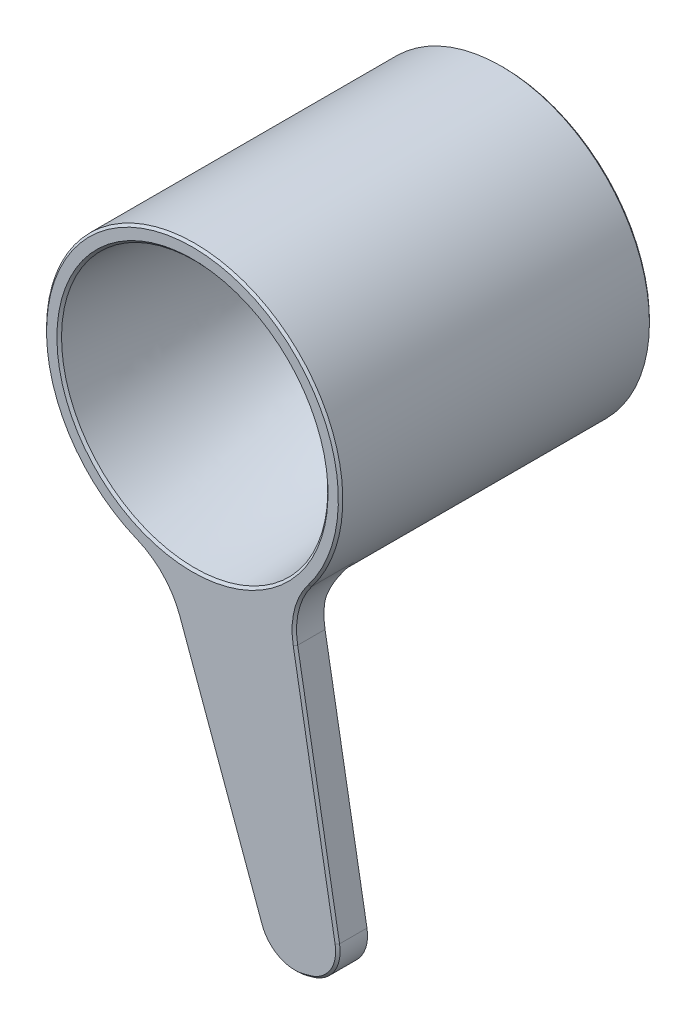
ISO-10303-21;
HEADER;
FILE_DESCRIPTION(('STEP AP214'),'2;1');
FILE_NAME('part.step','',(''),(''),'','','');
FILE_SCHEMA(('AUTOMOTIVE_DESIGN { 1 0 10303 214 1 1 1 1 }'));
ENDSEC;
DATA;
#1=APPLICATION_CONTEXT('core data for automotive mechanical design processes');
#2=APPLICATION_PROTOCOL_DEFINITION('international standard','automotive_design',2000,#1);
#3=PRODUCT_CONTEXT('',#1,'mechanical');
#4=PRODUCT('Part','Part','',(#3));
#5=PRODUCT_RELATED_PRODUCT_CATEGORY('part','',(#4));
#6=PRODUCT_DEFINITION_FORMATION('','',#4);
#7=PRODUCT_DEFINITION_CONTEXT('part definition',#1,'design');
#8=PRODUCT_DEFINITION('design','',#6,#7);
#9=PRODUCT_DEFINITION_SHAPE('','',#8);
#10=(LENGTH_UNIT() NAMED_UNIT(*) SI_UNIT(.MILLI.,.METRE.));
#11=(NAMED_UNIT(*) PLANE_ANGLE_UNIT() SI_UNIT($,.RADIAN.));
#12=(NAMED_UNIT(*) SI_UNIT($,.STERADIAN.) SOLID_ANGLE_UNIT());
#13=UNCERTAINTY_MEASURE_WITH_UNIT(LENGTH_MEASURE(1.E-05),#10,'distance_accuracy_value','');
#14=(GEOMETRIC_REPRESENTATION_CONTEXT(3) GLOBAL_UNCERTAINTY_ASSIGNED_CONTEXT((#13)) GLOBAL_UNIT_ASSIGNED_CONTEXT((#10,
#11,#12)) REPRESENTATION_CONTEXT('',''));
#15=CARTESIAN_POINT('',(0.,0.,0.));
#16=DIRECTION('',(0.,0.,1.));
#17=DIRECTION('',(1.,0.,0.));
#18=AXIS2_PLACEMENT_3D('',#15,#16,#17);
#19=CARTESIAN_POINT('',(-101.876054848858,-143.2985377115,29.3));
#20=DIRECTION('',(0.,0.,-1.));
#21=DIRECTION('',(-0.258819045102522,0.965925826289068,0.));
#22=AXIS2_PLACEMENT_3D('',#19,#20,#21);
#23=CONICAL_SURFACE('',#22,18.0000000000096,0.785398162500003);
#24=CARTESIAN_POINT('',(-101.876054848858,-143.2985377115,29.3));
#25=DIRECTION('',(0.,0.,-1.));
#26=DIRECTION('',(-0.258819045102523,0.965925826289068,0.));
#27=AXIS2_PLACEMENT_3D('',#24,#25,#26);
#28=CIRCLE('',#27,18.0000000000096);
#29=CARTESIAN_POINT('',(-106.534797660706,-125.911872838288,29.3));
#30=VERTEX_POINT('',#29);
#31=EDGE_CURVE('E220',#30,#30,#28,.T.);
#32=ORIENTED_EDGE('',*,*,#31,.F.);
#33=EDGE_LOOP('',(#32));
#34=FACE_BOUND('',#33,.T.);
#35=CARTESIAN_POINT('',(-101.876054848858,-143.2985377115,29.));
#36=DIRECTION('',(0.,0.,1.));
#37=DIRECTION('',(-0.258819045102522,0.965925826289068,0.));
#38=AXIS2_PLACEMENT_3D('',#35,#36,#37);
#39=CIRCLE('',#38,18.3000000000096);
#40=CARTESIAN_POINT('',(-106.612443374237,-125.622095090401,29.));
#41=VERTEX_POINT('',#40);
#42=EDGE_CURVE('E243',#41,#41,#39,.T.);
#43=ORIENTED_EDGE('',*,*,#42,.F.);
#44=EDGE_LOOP('',(#43));
#45=FACE_BOUND('',#44,.T.);
#46=ADVANCED_FACE('F42',(#34,#45),#23,.F.);
#47=CARTESIAN_POINT('',(-101.876054848858,-143.2985377115,29.));
#48=DIRECTION('',(0.,0.,1.));
#49=DIRECTION('',(0.258819045102522,-0.965925826289068,0.));
#50=AXIS2_PLACEMENT_3D('',#47,#48,#49);
#51=CONICAL_SURFACE('',#50,19.7,0.785398162500003);
#52=CARTESIAN_POINT('',(-101.876054848858,-143.2985377115,29.));
#53=DIRECTION('',(0.,0.,-1.));
#54=DIRECTION('',(-0.258819045102522,0.965925826289068,0.));
#55=AXIS2_PLACEMENT_3D('',#52,#53,#54);
#56=CIRCLE('',#55,19.7);
#57=CARTESIAN_POINT('',(-106.974790037378,-124.269798933606,29.));
#58=VERTEX_POINT('',#57);
#59=EDGE_CURVE('E241',#58,#58,#56,.T.);
#60=ORIENTED_EDGE('',*,*,#59,.F.);
#61=EDGE_LOOP('',(#60));
#62=FACE_BOUND('',#61,.T.);
#63=CARTESIAN_POINT('',(-101.876054848858,-143.2985377115,29.3));
#64=DIRECTION('',(0.,0.,1.));
#65=DIRECTION('',(-0.258819045102522,0.965925826289068,0.));
#66=AXIS2_PLACEMENT_3D('',#63,#64,#65);
#67=CIRCLE('',#66,20.);
#68=CARTESIAN_POINT('',(-107.052435750909,-123.980021185719,29.3));
#69=VERTEX_POINT('',#68);
#70=EDGE_CURVE('E207',#69,#69,#67,.T.);
#71=ORIENTED_EDGE('',*,*,#70,.F.);
#72=EDGE_LOOP('',(#71));
#73=FACE_BOUND('',#72,.T.);
#74=ADVANCED_FACE('F44',(#62,#73),#51,.T.);
#75=CARTESIAN_POINT('',(-105.588769718902,-162.950910298385,70.7));
#76=DIRECTION('',(0.664463024388675,0.24184476264798,-0.707106781186546));
#77=DIRECTION('',(0.,-0.946188648339463,-0.323615577118191));
#78=AXIS2_PLACEMENT_3D('',#75,#76,#77);
#79=PLANE('',#78);
#80=DIRECTION('',(0.664463024388668,0.241844762647976,0.707106781186553));
#81=VECTOR('',#80,1.);
#82=CARTESIAN_POINT('',(-92.7435598715085,-198.242834302256,70.7));
#83=LINE('',#82,#81);
#84=CARTESIAN_POINT('',(-92.7435598715085,-198.242834302256,70.7));
#85=VERTEX_POINT('',#84);
#86=CARTESIAN_POINT('',(-92.4616520852727,-198.140228259258,71.));
#87=VERTEX_POINT('',#86);
#88=EDGE_CURVE('E52',#85,#87,#83,.T.);
#89=ORIENTED_EDGE('',*,*,#88,.T.);
#90=DIRECTION('',(0.342020143325675,-0.939692620785906,0.));
#91=VECTOR('',#90,1.);
#92=CARTESIAN_POINT('',(-104.37433452665,-165.41040224644,71.));
#93=LINE('',#92,#91);
#94=CARTESIAN_POINT('',(-103.605857648852,-167.521775115563,71.));
#95=VERTEX_POINT('',#94);
#96=EDGE_CURVE('E217',#95,#87,#93,.T.);
#97=ORIENTED_EDGE('',*,*,#96,.F.);
#98=DIRECTION('',(-0.664463024388672,-0.241844762647977,-0.707106781186549));
#99=VECTOR('',#98,1.);
#100=CARTESIAN_POINT('',(-103.605857648852,-167.521775115563,71.));
#101=LINE('',#100,#99);
#102=CARTESIAN_POINT('',(-103.887765435088,-167.62438115856,70.7));
#103=VERTEX_POINT('',#102);
#104=EDGE_CURVE('E11',#95,#103,#101,.T.);
#105=ORIENTED_EDGE('',*,*,#104,.T.);
#106=DIRECTION('',(-0.342020143325675,0.939692620785906,0.));
#107=VECTOR('',#106,1.);
#108=CARTESIAN_POINT('',(-105.588769718902,-162.950910298385,70.7));
#109=LINE('',#108,#107);
#110=EDGE_CURVE('E266',#85,#103,#109,.T.);
#111=ORIENTED_EDGE('',*,*,#110,.F.);
#112=EDGE_LOOP('',(#89,#97,#105,#111));
#113=FACE_BOUND('',#112,.T.);
#114=ADVANCED_FACE('F416',(#113),#79,.F.);
#115=CARTESIAN_POINT('',(-113.284691642947,-171.044582591817,71.));
#116=DIRECTION('',(0.,0.,1.));
#117=DIRECTION('',(0.258819045102522,-0.965925826289068,0.));
#118=AXIS2_PLACEMENT_3D('',#115,#116,#117);
#119=CONICAL_SURFACE('',#118,10.3,0.785398162499996);
#120=DIRECTION('',(-0.268904148039819,-0.653980549532613,-0.707106781186549));
#121=VECTOR('',#120,1.);
#122=CARTESIAN_POINT('',(-109.367726343643,-161.518440516242,71.));
#123=LINE('',#122,#121);
#124=CARTESIAN_POINT('',(-109.367726343643,-161.518440516242,71.));
#125=VERTEX_POINT('',#124);
#126=CARTESIAN_POINT('',(-109.481812711584,-161.795900965045,70.7));
#127=VERTEX_POINT('',#126);
#128=EDGE_CURVE('E288',#125,#127,#123,.T.);
#129=ORIENTED_EDGE('',*,*,#128,.T.);
#130=CARTESIAN_POINT('',(-113.284691642947,-171.044582591817,70.7));
#131=DIRECTION('',(0.,0.,1.));
#132=DIRECTION('',(0.258819045102522,-0.965925826289068,0.));
#133=AXIS2_PLACEMENT_3D('',#130,#131,#132);
#134=CIRCLE('',#133,10.);
#135=EDGE_CURVE('E366',#103,#127,#134,.T.);
#136=ORIENTED_EDGE('',*,*,#135,.F.);
#137=ORIENTED_EDGE('',*,*,#104,.F.);
#138=CARTESIAN_POINT('',(-113.284691642947,-171.044582591817,71.));
#139=DIRECTION('',(0.,0.,-1.));
#140=DIRECTION('',(0.258819045102521,-0.965925826289068,0.));
#141=AXIS2_PLACEMENT_3D('',#138,#139,#140);
#142=CIRCLE('',#141,10.3);
#143=EDGE_CURVE('E228',#125,#95,#142,.T.);
#144=ORIENTED_EDGE('',*,*,#143,.F.);
#145=EDGE_LOOP('',(#129,#136,#137,#144));
#146=FACE_BOUND('',#145,.T.);
#147=ADVANCED_FACE('F397',(#146),#119,.F.);
#148=CARTESIAN_POINT('',(-88.0450967675789,-196.532733585627,71.));
#149=DIRECTION('',(0.,0.,-1.));
#150=DIRECTION('',(-0.258819045102522,0.965925826289068,0.));
#151=AXIS2_PLACEMENT_3D('',#148,#149,#150);
#152=CONICAL_SURFACE('',#151,4.7,0.785398162499998);
#153=DIRECTION('',(-0.183012701892219,0.683012701892228,0.707106781186539));
#154=VECTOR('',#153,1.);
#155=CARTESIAN_POINT('',(-86.7510015420663,-201.362362717073,70.7));
#156=LINE('',#155,#154);
#157=CARTESIAN_POINT('',(-86.7510015420663,-201.362362717073,70.7));
#158=VERTEX_POINT('',#157);
#159=CARTESIAN_POINT('',(-86.8286472555971,-201.072584969186,71.));
#160=VERTEX_POINT('',#159);
#161=EDGE_CURVE('E291',#158,#160,#156,.T.);
#162=ORIENTED_EDGE('',*,*,#161,.T.);
#163=CARTESIAN_POINT('',(-88.0450967675789,-196.532733585627,71.));
#164=DIRECTION('',(0.,0.,1.));
#165=DIRECTION('',(0.258819045102523,-0.965925826289068,0.));
#166=AXIS2_PLACEMENT_3D('',#163,#164,#165);
#167=CIRCLE('',#166,4.7);
#168=EDGE_CURVE('E213',#87,#160,#167,.T.);
#169=ORIENTED_EDGE('',*,*,#168,.F.);
#170=ORIENTED_EDGE('',*,*,#88,.F.);
#171=CARTESIAN_POINT('',(-88.0450967675789,-196.532733585627,70.7));
#172=DIRECTION('',(0.,0.,-1.));
#173=DIRECTION('',(0.258819045102522,-0.965925826289068,0.));
#174=AXIS2_PLACEMENT_3D('',#171,#172,#173);
#175=CIRCLE('',#174,5.);
#176=EDGE_CURVE('E246',#158,#85,#175,.T.);
#177=ORIENTED_EDGE('',*,*,#176,.F.);
#178=EDGE_LOOP('',(#162,#169,#170,#177));
#179=FACE_BOUND('',#178,.T.);
#180=ADVANCED_FACE('F442',(#179),#152,.T.);
#181=CARTESIAN_POINT('',(-101.876054848858,-143.2985377115,70.7));
#182=DIRECTION('',(0.,0.,-1.));
#183=DIRECTION('',(-0.258819045102522,0.965925826289068,0.));
#184=AXIS2_PLACEMENT_3D('',#181,#182,#183);
#185=CONICAL_SURFACE('',#184,20.,0.7853981625);
#186=DIRECTION('',(0.559868098151802,-0.431911695456239,-0.707106781186549));
#187=VECTOR('',#186,1.);
#188=CARTESIAN_POINT('',(-86.278125615196,-155.331600647497,71.));
#189=LINE('',#188,#187);
#190=CARTESIAN_POINT('',(-86.278125615196,-155.331600647497,71.));
#191=VERTEX_POINT('',#190);
#192=CARTESIAN_POINT('',(-86.0405936979321,-155.514845260736,70.7));
#193=VERTEX_POINT('',#192);
#194=EDGE_CURVE('E238',#191,#193,#189,.T.);
#195=ORIENTED_EDGE('',*,*,#194,.T.);
#196=CARTESIAN_POINT('',(-101.876054848858,-143.2985377115,70.7));
#197=DIRECTION('',(0.,0.,-1.));
#198=DIRECTION('',(0.258819045102522,-0.965925826289068,0.));
#199=AXIS2_PLACEMENT_3D('',#196,#197,#198);
#200=CIRCLE('',#199,20.);
#201=EDGE_CURVE('E197',#127,#193,#200,.T.);
#202=ORIENTED_EDGE('',*,*,#201,.F.);
#203=ORIENTED_EDGE('',*,*,#128,.F.);
#204=CARTESIAN_POINT('',(-101.876054848858,-143.2985377115,71.));
#205=DIRECTION('',(0.,0.,1.));
#206=DIRECTION('',(0.258819045102523,-0.965925826289068,0.));
#207=AXIS2_PLACEMENT_3D('',#204,#205,#206);
#208=CIRCLE('',#207,19.7);
#209=EDGE_CURVE('E259',#191,#125,#208,.T.);
#210=ORIENTED_EDGE('',*,*,#209,.F.);
#211=EDGE_LOOP('',(#195,#202,#203,#210));
#212=FACE_BOUND('',#211,.T.);
#213=ADVANCED_FACE('F395',(#212),#185,.T.);
#214=CARTESIAN_POINT('',(-91.1765412741523,-202.548182514357,70.7));
#215=DIRECTION('',(-0.183012701892217,0.68301270189222,-0.707106781186548));
#216=DIRECTION('',(-0.968100345886376,0.,0.250562807085728));
#217=AXIS2_PLACEMENT_3D('',#214,#215,#216);
#218=PLANE('',#217);
#219=DIRECTION('',(-0.183012701892217,0.68301270189222,0.707106781186548));
#220=VECTOR('',#219,1.);
#221=CARTESIAN_POINT('',(-85.9428227433477,-201.145811860616,70.7));
#222=LINE('',#221,#220);
#223=CARTESIAN_POINT('',(-85.9428227433477,-201.145811860616,70.7));
#224=VERTEX_POINT('',#223);
#225=CARTESIAN_POINT('',(-86.0204684568785,-200.856034112729,71.));
#226=VERTEX_POINT('',#225);
#227=EDGE_CURVE('E236',#224,#226,#222,.T.);
#228=ORIENTED_EDGE('',*,*,#227,.T.);
#229=DIRECTION('',(0.965925826289069,0.258819045102518,0.));
#230=VECTOR('',#229,1.);
#231=CARTESIAN_POINT('',(-86.4245578562379,-200.964309540958,71.));
#232=LINE('',#231,#230);
#233=EDGE_CURVE('E216',#160,#226,#232,.T.);
#234=ORIENTED_EDGE('',*,*,#233,.F.);
#235=ORIENTED_EDGE('',*,*,#161,.F.);
#236=DIRECTION('',(-0.965925826289069,-0.258819045102518,0.));
#237=VECTOR('',#236,1.);
#238=CARTESIAN_POINT('',(-91.1765412741523,-202.548182514357,70.7));
#239=LINE('',#238,#237);
#240=EDGE_CURVE('E232',#224,#158,#239,.T.);
#241=ORIENTED_EDGE('',*,*,#240,.F.);
#242=EDGE_LOOP('',(#228,#234,#235,#241));
#243=FACE_BOUND('',#242,.T.);
#244=ADVANCED_FACE('F383',(#243),#218,.F.);
#245=CARTESIAN_POINT('',(-78.122863122469,-161.622999035353,71.));
#246=DIRECTION('',(0.,0.,1.));
#247=DIRECTION('',(0.258819045102522,-0.965925826289068,0.));
#248=AXIS2_PLACEMENT_3D('',#245,#246,#247);
#249=CONICAL_SURFACE('',#248,10.3,0.785398162499996);
#250=DIRECTION('',(0.696364240320018,0.122787803968972,-0.707106781186549));
#251=VECTOR('',#250,1.);
#252=CARTESIAN_POINT('',(-88.2663829784947,-163.411575265323,71.));
#253=LINE('',#252,#251);
#254=CARTESIAN_POINT('',(-88.2663829784947,-163.411575265323,71.));
#255=VERTEX_POINT('',#254);
#256=CARTESIAN_POINT('',(-87.9709406525911,-163.359480812023,70.7));
#257=VERTEX_POINT('',#256);
#258=EDGE_CURVE('E284',#255,#257,#253,.T.);
#259=ORIENTED_EDGE('',*,*,#258,.T.);
#260=CARTESIAN_POINT('',(-78.122863122469,-161.622999035353,70.7));
#261=DIRECTION('',(0.,0.,1.));
#262=DIRECTION('',(0.258819045102522,-0.965925826289068,0.));
#263=AXIS2_PLACEMENT_3D('',#260,#261,#262);
#264=CIRCLE('',#263,10.);
#265=EDGE_CURVE('E165',#193,#257,#264,.T.);
#266=ORIENTED_EDGE('',*,*,#265,.F.);
#267=ORIENTED_EDGE('',*,*,#194,.F.);
#268=CARTESIAN_POINT('',(-78.122863122469,-161.622999035353,71.));
#269=DIRECTION('',(0.,0.,-1.));
#270=DIRECTION('',(0.258819045102521,-0.965925826289068,0.));
#271=AXIS2_PLACEMENT_3D('',#268,#269,#270);
#272=CIRCLE('',#271,10.3);
#273=EDGE_CURVE('E256',#255,#191,#272,.T.);
#274=ORIENTED_EDGE('',*,*,#273,.F.);
#275=EDGE_LOOP('',(#259,#266,#267,#274));
#276=FACE_BOUND('',#275,.T.);
#277=ADVANCED_FACE('F393',(#276),#249,.F.);
#278=CARTESIAN_POINT('',(-87.2369179688603,-196.316182729171,71.));
#279=DIRECTION('',(0.,0.,-1.));
#280=DIRECTION('',(-0.258819045102522,0.965925826289068,0.));
#281=AXIS2_PLACEMENT_3D('',#278,#279,#280);
#282=CONICAL_SURFACE('',#281,4.7,0.785398162500005);
#283=DIRECTION('',(-0.696364240320017,-0.122787803968971,0.70710678118655));
#284=VECTOR('',#283,1.);
#285=CARTESIAN_POINT('',(-82.3128792037993,-195.447941840836,70.7));
#286=LINE('',#285,#284);
#287=CARTESIAN_POINT('',(-82.3128792037993,-195.447941840836,70.7));
#288=VERTEX_POINT('',#287);
#289=CARTESIAN_POINT('',(-82.6083215297029,-195.500036294136,71.));
#290=VERTEX_POINT('',#289);
#291=EDGE_CURVE('E60',#288,#290,#286,.T.);
#292=ORIENTED_EDGE('',*,*,#291,.T.);
#293=CARTESIAN_POINT('',(-87.2369179688603,-196.316182729171,71.));
#294=DIRECTION('',(0.,0.,1.));
#295=DIRECTION('',(0.258819045102523,-0.965925826289068,0.));
#296=AXIS2_PLACEMENT_3D('',#293,#294,#295);
#297=CIRCLE('',#296,4.7);
#298=EDGE_CURVE('E250',#226,#290,#297,.T.);
#299=ORIENTED_EDGE('',*,*,#298,.F.);
#300=ORIENTED_EDGE('',*,*,#227,.F.);
#301=CARTESIAN_POINT('',(-87.2369179688603,-196.316182729171,70.7));
#302=DIRECTION('',(0.,0.,-1.));
#303=DIRECTION('',(0.258819045102522,-0.965925826289068,0.));
#304=AXIS2_PLACEMENT_3D('',#301,#302,#303);
#305=CIRCLE('',#304,5.);
#306=EDGE_CURVE('E279',#288,#224,#305,.T.);
#307=ORIENTED_EDGE('',*,*,#306,.F.);
#308=EDGE_LOOP('',(#292,#299,#300,#307));
#309=FACE_BOUND('',#308,.T.);
#310=ADVANCED_FACE('F387',(#309),#282,.T.);
#311=CARTESIAN_POINT('',(-81.5172830112617,-199.959992063332,70.7));
#312=DIRECTION('',(-0.696364240320022,-0.12278780396897,-0.707106781186545));
#313=DIRECTION('',(-0.712498293208667,0.,0.701673843159866));
#314=AXIS2_PLACEMENT_3D('',#311,#312,#313);
#315=PLANE('',#314);
#316=ORIENTED_EDGE('',*,*,#258,.F.);
#317=DIRECTION('',(-0.173648177666926,0.984807753012209,0.));
#318=VECTOR('',#317,1.);
#319=CARTESIAN_POINT('',(-88.656548914662,-161.198834284903,71.));
#320=LINE('',#319,#318);
#321=EDGE_CURVE('E253',#290,#255,#320,.T.);
#322=ORIENTED_EDGE('',*,*,#321,.F.);
#323=ORIENTED_EDGE('',*,*,#291,.F.);
#324=DIRECTION('',(0.173648177666926,-0.984807753012209,0.));
#325=VECTOR('',#324,1.);
#326=CARTESIAN_POINT('',(-81.5172830112617,-199.959992063332,70.7));
#327=LINE('',#326,#325);
#328=EDGE_CURVE('E168',#257,#288,#327,.T.);
#329=ORIENTED_EDGE('',*,*,#328,.F.);
#330=EDGE_LOOP('',(#316,#322,#323,#329));
#331=FACE_BOUND('',#330,.T.);
#332=ADVANCED_FACE('F388',(#331),#315,.F.);
#333=CARTESIAN_POINT('',(-101.876054848858,-143.2985377115,71.));
#334=DIRECTION('',(0.,0.,1.));
#335=DIRECTION('',(0.258819045102522,-0.965925826289068,0.));
#336=AXIS2_PLACEMENT_3D('',#333,#334,#335);
#337=CONICAL_SURFACE('',#336,18.3001939572869,0.829672497558748);
#338=CARTESIAN_POINT('',(-101.876054848858,-143.2985377115,71.));
#339=DIRECTION('',(0.,0.,-1.));
#340=DIRECTION('',(0.258819045102522,-0.965925826289068,0.));
#341=AXIS2_PLACEMENT_3D('',#338,#339,#340);
#342=CIRCLE('',#341,18.3001939572869);
#343=CARTESIAN_POINT('',(-97.1396161236424,-160.975167680943,71.));
#344=VERTEX_POINT('',#343);
#345=EDGE_CURVE('E248',#344,#344,#342,.T.);
#346=ORIENTED_EDGE('',*,*,#345,.F.);
#347=EDGE_LOOP('',(#346));
#348=FACE_BOUND('',#347,.T.);
#349=CARTESIAN_POINT('',(-101.876054848858,-143.2985377115,70.7011753617605));
#350=DIRECTION('',(0.,0.,1.));
#351=DIRECTION('',(-0.258819045102523,0.965925826289068,0.));
#352=AXIS2_PLACEMENT_3D('',#349,#350,#351);
#353=CIRCLE('',#352,17.9736640575314);
#354=CARTESIAN_POINT('',(-106.527981417222,-125.937311405287,70.7011753617605));
#355=VERTEX_POINT('',#354);
#356=EDGE_CURVE('E201',#355,#355,#353,.T.);
#357=ORIENTED_EDGE('',*,*,#356,.F.);
#358=EDGE_LOOP('',(#357));
#359=FACE_BOUND('',#358,.T.);
#360=ADVANCED_FACE('F336',(#348,#359),#337,.F.);
#361=CARTESIAN_POINT('',(-101.876054848858,-143.2985377115,47.5807574279534));
#362=DIRECTION('',(0.,0.,-1.));
#363=DIRECTION('',(-0.258819045102522,0.965925826289068,0.));
#364=AXIS2_PLACEMENT_3D('',#361,#362,#363);
#365=TOROIDAL_SURFACE('',#364,17.0000000000096,1.);
#366=CARTESIAN_POINT('',(-101.876054848858,-143.2985377115,47.8605950450817));
#367=DIRECTION('',(0.,0.,-1.));
#368=DIRECTION('',(-0.258819045102523,0.965925826289068,0.));
#369=AXIS2_PLACEMENT_3D('',#366,#367,#368);
#370=CIRCLE('',#369,16.0399526532396);
#371=CARTESIAN_POINT('',(-106.027500078059,-127.805133191282,47.8605950450817));
#372=VERTEX_POINT('',#371);
#373=EDGE_CURVE('E218',#372,#372,#370,.T.);
#374=ORIENTED_EDGE('',*,*,#373,.F.);
#375=EDGE_LOOP('',(#374));
#376=FACE_BOUND('',#375,.T.);
#377=CARTESIAN_POINT('',(-101.876054848858,-143.2985377115,47.5807574279534));
#378=DIRECTION('',(0.,0.,1.));
#379=DIRECTION('',(-0.258819045102523,0.965925826289068,0.));
#380=AXIS2_PLACEMENT_3D('',#377,#378,#379);
#381=CIRCLE('',#380,18.0000000000096);
#382=CARTESIAN_POINT('',(-106.534797660706,-125.911872838288,47.5807574279534));
#383=VERTEX_POINT('',#382);
#384=EDGE_CURVE('E235',#383,#383,#381,.T.);
#385=ORIENTED_EDGE('',*,*,#384,.F.);
#386=EDGE_LOOP('',(#385));
#387=FACE_BOUND('',#386,.T.);
#388=ADVANCED_FACE('F333',(#376,#387),#365,.F.);
#389=CARTESIAN_POINT('',(-101.876054848858,-143.2985377115,65.));
#390=DIRECTION('',(0.,0.,-1.));
#391=DIRECTION('',(-0.258819045102522,0.965925826289068,0.));
#392=AXIS2_PLACEMENT_3D('',#389,#390,#391);
#393=TOROIDAL_SURFACE('',#392,22.,2.);
#394=CARTESIAN_POINT('',(-88.0490658405104,-160.410357455847,67.));
#395=CARTESIAN_POINT('',(-88.0430494585621,-160.361104765157,66.9999988846733));
#396=CARTESIAN_POINT('',(-88.036665894473,-160.311901597283,66.9990786135573));
#397=CARTESIAN_POINT('',(-88.023016123055,-160.212487046188,66.9954774444101));
#398=CARTESIAN_POINT('',(-88.0157325286847,-160.162279528959,66.992755176487));
#399=CARTESIAN_POINT('',(-88.0002346007577,-160.060876013287,66.9855515393887));
#400=CARTESIAN_POINT('',(-87.992001886565,-160.009685805144,66.9810288491938));
#401=CARTESIAN_POINT('',(-87.9745573199932,-159.906334945843,66.9702238748284));
#402=CARTESIAN_POINT('',(-87.9653261945512,-159.854181860461,66.9639005892727));
#403=CARTESIAN_POINT('',(-87.9458355444581,-159.748926063997,66.9494940997602));
#404=CARTESIAN_POINT('',(-87.935555935685,-159.695832633091,66.9413704830464));
#405=CARTESIAN_POINT('',(-87.9139184815133,-159.58871879572,66.9233626583347));
#406=CARTESIAN_POINT('',(-87.9025398224681,-159.534709284796,66.9134388305237));
#407=CARTESIAN_POINT('',(-87.878653668062,-159.42578747473,66.8918296847876));
#408=CARTESIAN_POINT('',(-87.8661246987179,-159.370887572368,66.8801057008653));
#409=CARTESIAN_POINT('',(-87.8398874568765,-159.260213491206,66.8548954675482));
#410=CARTESIAN_POINT('',(-87.8261571346471,-159.204453165923,66.8413716348785));
#411=CARTESIAN_POINT('',(-87.7825650901226,-159.033731935474,66.7975994751291));
#412=CARTESIAN_POINT('',(-87.751263701238,-158.919724691229,66.7650326151273));
#413=CARTESIAN_POINT('',(-87.6834135049861,-158.688525772756,66.6929901968356));
#414=CARTESIAN_POINT('',(-87.6466769886534,-158.57147454616,66.6532443609766));
#415=CARTESIAN_POINT('',(-87.5675477961112,-158.334483892696,66.5667741901285));
#416=CARTESIAN_POINT('',(-87.5249621937108,-158.214701682899,66.5197973095904));
#417=CARTESIAN_POINT('',(-87.4336861960737,-157.972501662317,66.4190297558906));
#418=CARTESIAN_POINT('',(-87.3847969951107,-157.850251679366,66.3650158008098));
#419=CARTESIAN_POINT('',(-87.3043350094836,-157.659872574724,66.2757155501991));
#420=CARTESIAN_POINT('',(-87.2740485614894,-157.590445193818,66.2420189720151));
#421=CARTESIAN_POINT('',(-87.2082159997677,-157.444050909616,66.1687890186404));
#422=CARTESIAN_POINT('',(-87.1724938023961,-157.367260297313,66.1290616701248));
#423=CARTESIAN_POINT('',(-87.0951987825248,-157.206435824421,66.043833453269));
#424=CARTESIAN_POINT('',(-87.0534233815516,-157.122574862268,65.9981909108632));
#425=CARTESIAN_POINT('',(-86.9634054473566,-156.948021041324,65.9010661289845));
#426=CARTESIAN_POINT('',(-86.9149390942563,-156.85750975911,65.8494651180206));
#427=CARTESIAN_POINT('',(-86.8108723557514,-156.67011848965,65.7404113515545));
#428=CARTESIAN_POINT('',(-86.7550279936564,-156.573430725572,65.6828612829746));
#429=CARTESIAN_POINT('',(-86.6355056608884,-156.374234027777,65.5618876790935));
#430=CARTESIAN_POINT('',(-86.5715658290848,-156.271932164769,65.4983819163285));
#431=CARTESIAN_POINT('',(-86.4351252813438,-156.062139102565,65.3654875737111));
#432=CARTESIAN_POINT('',(-86.3623467992931,-155.954872779597,65.2960292196373));
#433=CARTESIAN_POINT('',(-86.2074884018219,-155.735886002794,65.1512053132425));
#434=CARTESIAN_POINT('',(-86.125117288316,-155.624411765662,65.0757785830843));
#435=CARTESIAN_POINT('',(-86.0405936979325,-155.514845260736,65.));
#436=B_SPLINE_CURVE_WITH_KNOTS('',3,(#394,#395,#396,#397,#398,#399,#400,#401,#402,#403,#404,
#405,#406,#407,#408,#409,#410,#411,#412,#413,#414,#415,#416,#417,#418,#419,#420,#421,#422,#423,
#424,#425,#426,#427,#428,#429,#430,#431,#432,#433,#434,#435),.UNSPECIFIED.,.F.,.F.,(4,2,2,2,2,2,
2,2,2,2,2,2,2,2,2,2,2,2,2,2,4),(0.,0.148839827569559,0.301221024351109,0.457322166261245,
0.617309372857366,0.781336956881109,0.949548111456634,1.12207561291668,1.29904252198195,
1.66670346563217,2.05338759200283,2.45979538747237,2.88653019897304,3.13520771780149,
3.4158093141493,3.72841746924553,4.07309153570424,4.44987556026427,4.85880306026832,
5.29990007143931,5.77318716565208),.UNSPECIFIED.);
#437=CARTESIAN_POINT('',(-88.0490658405104,-160.410357455847,67.));
#438=VERTEX_POINT('',#437);
#439=CARTESIAN_POINT('',(-86.0405936979321,-155.514845260736,65.));
#440=VERTEX_POINT('',#439);
#441=EDGE_CURVE('E245',#438,#440,#436,.T.);
#442=ORIENTED_EDGE('',*,*,#441,.F.);
#443=CARTESIAN_POINT('',(-101.876054848858,-143.2985377115,67.));
#444=DIRECTION('',(0.,0.,1.));
#445=DIRECTION('',(-0.258819045102522,0.965925826289068,0.));
#446=AXIS2_PLACEMENT_3D('',#443,#444,#445);
#447=CIRCLE('',#446,22.);
#448=CARTESIAN_POINT('',(-105.294668715762,-165.031302819259,67.));
#449=VERTEX_POINT('',#448);
#450=EDGE_CURVE('E183',#449,#438,#447,.T.);
#451=ORIENTED_EDGE('',*,*,#450,.F.);
#452=CARTESIAN_POINT('',(-109.481812711584,-161.795900965045,65.));
#453=CARTESIAN_POINT('',(-109.353851276761,-161.848517748023,65.0757659304899));
#454=CARTESIAN_POINT('',(-109.226799692271,-161.903862036686,65.1511799683644));
#455=CARTESIAN_POINT('',(-108.983230223101,-162.016062675027,65.2959821542668));
#456=CARTESIAN_POINT('',(-108.866583381487,-162.072560496136,65.3654314435449));
#457=CARTESIAN_POINT('',(-108.643548077346,-162.186011708227,65.498311310328));
#458=CARTESIAN_POINT('',(-108.537031612524,-162.24263173297,65.5618116159314));
#459=CARTESIAN_POINT('',(-108.333933766,-162.355370533494,65.6827779836592));
#460=CARTESIAN_POINT('',(-108.237229239041,-162.411179284091,65.7403262101735));
#461=CARTESIAN_POINT('',(-108.053407413934,-162.521428602053,65.8493799643306));
#462=CARTESIAN_POINT('',(-107.966175016102,-162.575580915902,65.9009827214668));
#463=CARTESIAN_POINT('',(-107.800927605159,-162.681744668644,65.9981147709671));
#464=CARTESIAN_POINT('',(-107.722809596418,-162.733487130657,66.0437627099734));
#465=CARTESIAN_POINT('',(-107.575434854318,-162.83413087705,66.1290052917733));
#466=CARTESIAN_POINT('',(-107.506089157329,-162.882781295297,66.1687414599008));
#467=CARTESIAN_POINT('',(-107.375846654145,-162.976668372846,66.2419934379134));
#468=CARTESIAN_POINT('',(-107.314885449446,-163.021664489091,66.2757028976943));
#469=CARTESIAN_POINT('',(-107.150004619483,-163.146313555754,66.3650152914863));
#470=CARTESIAN_POINT('',(-107.046549711654,-163.22773286666,66.4190299581728));
#471=CARTESIAN_POINT('',(-106.846417600331,-163.391832574081,66.5197980204562));
#472=CARTESIAN_POINT('',(-106.749652232285,-163.474268319108,66.5667747028769));
#473=CARTESIAN_POINT('',(-106.562638054678,-163.639933606969,66.653244761694));
#474=CARTESIAN_POINT('',(-106.472300841858,-163.722930638577,66.692990611665));
#475=CARTESIAN_POINT('',(-106.297945001695,-163.889223704301,66.7650330670276));
#476=CARTESIAN_POINT('',(-106.21383410383,-163.972304352214,66.7975998684026));
#477=CARTESIAN_POINT('',(-106.090721471502,-164.098355412223,66.8413717335623));
#478=CARTESIAN_POINT('',(-106.050949873467,-164.139780095923,66.8548955590695));
#479=CARTESIAN_POINT('',(-105.972888894734,-164.222508647952,66.8801057932193));
#480=CARTESIAN_POINT('',(-105.934587352447,-164.263789505858,66.8918297682733));
#481=CARTESIAN_POINT('',(-105.859437527736,-164.346177408881,66.9134389143439));
#482=CARTESIAN_POINT('',(-105.822576853763,-164.38726299271,66.9233627320003));
#483=CARTESIAN_POINT('',(-105.75027742736,-164.469210865847,66.9413705569487));
#484=CARTESIAN_POINT('',(-105.71482610451,-164.510053323728,66.9494941620284));
#485=CARTESIAN_POINT('',(-105.645313927584,-164.591466906582,66.9639006515221));
#486=CARTESIAN_POINT('',(-105.611240327169,-164.632019963274,66.9702239238334));
#487=CARTESIAN_POINT('',(-105.544451681942,-164.712808326201,66.9810288982729));
#488=CARTESIAN_POINT('',(-105.511723736087,-164.753027453641,66.9855515739614));
#489=CARTESIAN_POINT('',(-105.447593763646,-164.833104188777,66.9927552102618));
#490=CARTESIAN_POINT('',(-105.416178721346,-164.872947600547,66.9954774611048));
#491=CARTESIAN_POINT('',(-105.354643000769,-164.952227459715,66.9990786323283));
#492=CARTESIAN_POINT('',(-105.324509205511,-164.991651873156,66.9999988887097));
#493=CARTESIAN_POINT('',(-105.294668715762,-165.031302819259,67.));
#494=B_SPLINE_CURVE_WITH_KNOTS('',3,(#452,#453,#454,#455,#456,#457,#458,#459,#460,#461,#462,
#463,#464,#465,#466,#467,#468,#469,#470,#471,#472,#473,#474,#475,#476,#477,#478,#479,#480,#481,
#482,#483,#484,#485,#486,#487,#488,#489,#490,#491,#492,#493),.UNSPECIFIED.,.F.,.F.,(4,2,2,2,2,2,
2,2,2,2,2,2,2,2,2,2,2,2,2,2,4),(0.,0.473208006291846,0.914248527159379,1.32314213563349,
1.69991486490133,2.04460022324842,2.35724223671932,2.63790021600633,2.88665656035805,
3.31335858138837,3.71974261798824,4.10641228810415,4.47406834816011,4.65103648972424,
4.82356771006962,4.99178509575501,5.15582144481531,5.31581996673189,5.4719349838657,
5.62433261707759,5.77319143352013),.UNSPECIFIED.);
#495=CARTESIAN_POINT('',(-109.481812711584,-161.795900965045,65.));
#496=VERTEX_POINT('',#495);
#497=EDGE_CURVE('E286',#496,#449,#494,.T.);
#498=ORIENTED_EDGE('',*,*,#497,.F.);
#499=CARTESIAN_POINT('',(-101.876054848858,-143.2985377115,65.));
#500=DIRECTION('',(0.,0.,-1.));
#501=DIRECTION('',(-0.258819045102522,0.965925826289068,0.));
#502=AXIS2_PLACEMENT_3D('',#499,#500,#501);
#503=CIRCLE('',#502,20.);
#504=EDGE_CURVE('E196',#440,#496,#503,.T.);
#505=ORIENTED_EDGE('',*,*,#504,.F.);
#506=EDGE_LOOP('',(#442,#451,#498,#505));
#507=FACE_BOUND('',#506,.T.);
#508=ADVANCED_FACE('F312',(#507),#393,.F.);
#509=CARTESIAN_POINT('',(-113.284691642947,-171.044582591817,26.));
#510=DIRECTION('',(0.,0.,-1.));
#511=DIRECTION('',(-0.258819045102522,0.965925826289068,0.));
#512=AXIS2_PLACEMENT_3D('',#509,#510,#511);
#513=CYLINDRICAL_SURFACE('',#512,10.);
#514=DIRECTION('',(0.,0.,-1.));
#515=VECTOR('',#514,1.);
#516=CARTESIAN_POINT('',(-103.887765435088,-167.62438115856,67.));
#517=LINE('',#516,#515);
#518=CARTESIAN_POINT('',(-103.887765435088,-167.62438115856,67.));
#519=VERTEX_POINT('',#518);
#520=EDGE_CURVE('E269',#103,#519,#517,.T.);
#521=ORIENTED_EDGE('',*,*,#520,.F.);
#522=ORIENTED_EDGE('',*,*,#135,.T.);
#523=DIRECTION('',(0.,0.,1.));
#524=VECTOR('',#523,1.);
#525=CARTESIAN_POINT('',(-109.481812711584,-161.795900965045,26.));
#526=LINE('',#525,#524);
#527=EDGE_CURVE('E203',#496,#127,#526,.T.);
#528=ORIENTED_EDGE('',*,*,#527,.F.);
#529=ORIENTED_EDGE('',*,*,#497,.T.);
#530=CARTESIAN_POINT('',(-113.284691642947,-171.044582591817,67.));
#531=DIRECTION('',(0.,0.,1.));
#532=DIRECTION('',(-0.258819045102522,0.965925826289068,0.));
#533=AXIS2_PLACEMENT_3D('',#530,#531,#532);
#534=CIRCLE('',#533,10.);
#535=EDGE_CURVE('E185',#519,#449,#534,.T.);
#536=ORIENTED_EDGE('',*,*,#535,.F.);
#537=EDGE_LOOP('',(#521,#522,#528,#529,#536));
#538=FACE_BOUND('',#537,.T.);
#539=ADVANCED_FACE('F302',(#538),#513,.F.);
#540=CARTESIAN_POINT('',(-78.122863122469,-161.622999035353,26.));
#541=DIRECTION('',(0.,0.,-1.));
#542=DIRECTION('',(-0.258819045102522,0.965925826289068,0.));
#543=AXIS2_PLACEMENT_3D('',#540,#541,#542);
#544=CYLINDRICAL_SURFACE('',#543,10.);
#545=DIRECTION('',(0.,0.,-1.));
#546=VECTOR('',#545,1.);
#547=CARTESIAN_POINT('',(-86.0405936979321,-155.514845260736,26.));
#548=LINE('',#547,#546);
#549=EDGE_CURVE('E194',#193,#440,#548,.T.);
#550=ORIENTED_EDGE('',*,*,#549,.F.);
#551=ORIENTED_EDGE('',*,*,#265,.T.);
#552=DIRECTION('',(0.,0.,1.));
#553=VECTOR('',#552,1.);
#554=CARTESIAN_POINT('',(-87.9709406525911,-163.359480812023,71.));
#555=LINE('',#554,#553);
#556=CARTESIAN_POINT('',(-87.9709406525911,-163.359480812023,67.));
#557=VERTEX_POINT('',#556);
#558=EDGE_CURVE('E157',#557,#257,#555,.T.);
#559=ORIENTED_EDGE('',*,*,#558,.F.);
#560=CARTESIAN_POINT('',(-78.122863122469,-161.622999035353,67.));
#561=DIRECTION('',(0.,0.,1.));
#562=DIRECTION('',(-0.258819045102522,0.965925826289068,0.));
#563=AXIS2_PLACEMENT_3D('',#560,#561,#562);
#564=CIRCLE('',#563,10.);
#565=EDGE_CURVE('E162',#438,#557,#564,.T.);
#566=ORIENTED_EDGE('',*,*,#565,.F.);
#567=ORIENTED_EDGE('',*,*,#441,.T.);
#568=EDGE_LOOP('',(#550,#551,#559,#566,#567));
#569=FACE_BOUND('',#568,.T.);
#570=ADVANCED_FACE('F160',(#569),#544,.F.);
#571=CARTESIAN_POINT('',(-88.0450967675789,-196.532733585627,67.));
#572=DIRECTION('',(0.,0.,1.));
#573=DIRECTION('',(0.258819045102522,-0.965925826289068,0.));
#574=AXIS2_PLACEMENT_3D('',#571,#572,#573);
#575=CYLINDRICAL_SURFACE('',#574,5.);
#576=DIRECTION('',(0.,0.,-1.));
#577=VECTOR('',#576,1.);
#578=CARTESIAN_POINT('',(-86.7510015420663,-201.362362717073,67.));
#579=LINE('',#578,#577);
#580=CARTESIAN_POINT('',(-86.7510015420663,-201.362362717073,67.));
#581=VERTEX_POINT('',#580);
#582=EDGE_CURVE('E224',#158,#581,#579,.T.);
#583=ORIENTED_EDGE('',*,*,#582,.F.);
#584=ORIENTED_EDGE('',*,*,#176,.T.);
#585=DIRECTION('',(0.,0.,1.));
#586=VECTOR('',#585,1.);
#587=CARTESIAN_POINT('',(-92.7435598715085,-198.242834302256,67.));
#588=LINE('',#587,#586);
#589=CARTESIAN_POINT('',(-92.7435598715085,-198.242834302256,67.));
#590=VERTEX_POINT('',#589);
#591=EDGE_CURVE('E262',#590,#85,#588,.T.);
#592=ORIENTED_EDGE('',*,*,#591,.F.);
#593=CARTESIAN_POINT('',(-88.0450967675789,-196.532733585627,67.));
#594=DIRECTION('',(0.,0.,-1.));
#595=DIRECTION('',(-0.258819045102522,0.965925826289068,0.));
#596=AXIS2_PLACEMENT_3D('',#593,#594,#595);
#597=CIRCLE('',#596,5.);
#598=EDGE_CURVE('E169',#581,#590,#597,.T.);
#599=ORIENTED_EDGE('',*,*,#598,.F.);
#600=EDGE_LOOP('',(#583,#584,#592,#599));
#601=FACE_BOUND('',#600,.T.);
#602=ADVANCED_FACE('F348',(#601),#575,.T.);
#603=CARTESIAN_POINT('',(-87.2369179688603,-196.316182729171,67.));
#604=DIRECTION('',(0.,0.,1.));
#605=DIRECTION('',(0.258819045102522,-0.965925826289068,0.));
#606=AXIS2_PLACEMENT_3D('',#603,#604,#605);
#607=CYLINDRICAL_SURFACE('',#606,5.);
#608=DIRECTION('',(0.,0.,-1.));
#609=VECTOR('',#608,1.);
#610=CARTESIAN_POINT('',(-82.3128792037993,-195.447941840836,67.));
#611=LINE('',#610,#609);
#612=CARTESIAN_POINT('',(-82.3128792037993,-195.447941840836,67.));
#613=VERTEX_POINT('',#612);
#614=EDGE_CURVE('E175',#288,#613,#611,.T.);
#615=ORIENTED_EDGE('',*,*,#614,.F.);
#616=ORIENTED_EDGE('',*,*,#306,.T.);
#617=DIRECTION('',(0.,0.,1.));
#618=VECTOR('',#617,1.);
#619=CARTESIAN_POINT('',(-85.9428227433477,-201.145811860616,67.));
#620=LINE('',#619,#618);
#621=CARTESIAN_POINT('',(-85.9428227433477,-201.145811860616,67.));
#622=VERTEX_POINT('',#621);
#623=EDGE_CURVE('E229',#622,#224,#620,.T.);
#624=ORIENTED_EDGE('',*,*,#623,.F.);
#625=CARTESIAN_POINT('',(-87.2369179688603,-196.316182729171,67.));
#626=DIRECTION('',(0.,0.,-1.));
#627=DIRECTION('',(-0.258819045102522,0.965925826289068,0.));
#628=AXIS2_PLACEMENT_3D('',#625,#626,#627);
#629=CIRCLE('',#628,5.);
#630=EDGE_CURVE('E178',#613,#622,#629,.T.);
#631=ORIENTED_EDGE('',*,*,#630,.F.);
#632=EDGE_LOOP('',(#615,#616,#624,#631));
#633=FACE_BOUND('',#632,.T.);
#634=ADVANCED_FACE('F343',(#633),#607,.T.);
#635=CARTESIAN_POINT('',(-81.5172830112617,-199.959992063332,67.));
#636=DIRECTION('',(0.984807753012209,0.173648177666926,0.));
#637=DIRECTION('',(0.,0.,-1.));
#638=AXIS2_PLACEMENT_3D('',#635,#636,#637);
#639=PLANE('',#638);
#640=ORIENTED_EDGE('',*,*,#558,.T.);
#641=ORIENTED_EDGE('',*,*,#328,.T.);
#642=ORIENTED_EDGE('',*,*,#614,.T.);
#643=DIRECTION('',(-0.173648177666926,0.984807753012209,0.));
#644=VECTOR('',#643,1.);
#645=CARTESIAN_POINT('',(-81.5172830112617,-199.959992063332,67.));
#646=LINE('',#645,#644);
#647=EDGE_CURVE('E172',#613,#557,#646,.T.);
#648=ORIENTED_EDGE('',*,*,#647,.T.);
#649=EDGE_LOOP('',(#640,#641,#642,#648));
#650=FACE_BOUND('',#649,.T.);
#651=ADVANCED_FACE('F173',(#650),#639,.T.);
#652=CARTESIAN_POINT('',(-101.876054848858,-143.2985377115,67.));
#653=DIRECTION('',(0.,0.,-1.));
#654=DIRECTION('',(0.,-1.,0.));
#655=AXIS2_PLACEMENT_3D('',#652,#653,#654);
#656=PLANE('',#655);
#657=ORIENTED_EDGE('',*,*,#535,.T.);
#658=ORIENTED_EDGE('',*,*,#450,.T.);
#659=ORIENTED_EDGE('',*,*,#565,.T.);
#660=ORIENTED_EDGE('',*,*,#647,.F.);
#661=ORIENTED_EDGE('',*,*,#630,.T.);
#662=DIRECTION('',(0.965925826289069,0.258819045102518,0.));
#663=VECTOR('',#662,1.);
#664=CARTESIAN_POINT('',(-91.1765412741523,-202.548182514357,67.));
#665=LINE('',#664,#663);
#666=EDGE_CURVE('E221',#581,#622,#665,.T.);
#667=ORIENTED_EDGE('',*,*,#666,.F.);
#668=ORIENTED_EDGE('',*,*,#598,.T.);
#669=DIRECTION('',(0.342020143325675,-0.939692620785906,0.));
#670=VECTOR('',#669,1.);
#671=CARTESIAN_POINT('',(-105.588769718902,-162.950910298385,67.));
#672=LINE('',#671,#670);
#673=EDGE_CURVE('E211',#519,#590,#672,.T.);
#674=ORIENTED_EDGE('',*,*,#673,.F.);
#675=EDGE_LOOP('',(#657,#658,#659,#660,#661,#667,#668,#674));
#676=FACE_BOUND('',#675,.T.);
#677=ADVANCED_FACE('F181',(#676),#656,.T.);
#678=CARTESIAN_POINT('',(-91.1765412741523,-202.548182514357,67.));
#679=DIRECTION('',(0.258819045102518,-0.965925826289069,0.));
#680=DIRECTION('',(0.,0.,-1.));
#681=AXIS2_PLACEMENT_3D('',#678,#679,#680);
#682=PLANE('',#681);
#683=ORIENTED_EDGE('',*,*,#623,.T.);
#684=ORIENTED_EDGE('',*,*,#240,.T.);
#685=ORIENTED_EDGE('',*,*,#582,.T.);
#686=ORIENTED_EDGE('',*,*,#666,.T.);
#687=EDGE_LOOP('',(#683,#684,#685,#686));
#688=FACE_BOUND('',#687,.T.);
#689=ADVANCED_FACE('F316',(#688),#682,.T.);
#690=CARTESIAN_POINT('',(-105.588769718902,-162.950910298385,67.));
#691=DIRECTION('',(-0.939692620785906,-0.342020143325675,0.));
#692=DIRECTION('',(-0.342020143325675,0.939692620785906,0.));
#693=AXIS2_PLACEMENT_3D('',#690,#691,#692);
#694=PLANE('',#693);
#695=ORIENTED_EDGE('',*,*,#591,.T.);
#696=ORIENTED_EDGE('',*,*,#110,.T.);
#697=ORIENTED_EDGE('',*,*,#520,.T.);
#698=ORIENTED_EDGE('',*,*,#673,.T.);
#699=EDGE_LOOP('',(#695,#696,#697,#698));
#700=FACE_BOUND('',#699,.T.);
#701=ADVANCED_FACE('F319',(#700),#694,.T.);
#702=CARTESIAN_POINT('',(-96.6996739468079,-162.617054237282,71.));
#703=DIRECTION('',(0.,0.,1.));
#704=DIRECTION('',(1.,0.,0.));
#705=AXIS2_PLACEMENT_3D('',#702,#703,#704);
#706=PLANE('',#705);
#707=ORIENTED_EDGE('',*,*,#143,.T.);
#708=ORIENTED_EDGE('',*,*,#96,.T.);
#709=ORIENTED_EDGE('',*,*,#168,.T.);
#710=ORIENTED_EDGE('',*,*,#233,.T.);
#711=ORIENTED_EDGE('',*,*,#298,.T.);
#712=ORIENTED_EDGE('',*,*,#321,.T.);
#713=ORIENTED_EDGE('',*,*,#273,.T.);
#714=ORIENTED_EDGE('',*,*,#209,.T.);
#715=EDGE_LOOP('',(#707,#708,#709,#710,#711,#712,#713,#714));
#716=FACE_BOUND('',#715,.T.);
#717=ORIENTED_EDGE('',*,*,#345,.T.);
#718=EDGE_LOOP('',(#717));
#719=FACE_BOUND('',#718,.T.);
#720=ADVANCED_FACE('F328',(#716,#719),#706,.T.);
#721=CARTESIAN_POINT('',(-97.2173120370129,-160.685202584703,29.));
#722=DIRECTION('',(0.,0.,-1.));
#723=DIRECTION('',(0.,-1.,0.));
#724=AXIS2_PLACEMENT_3D('',#721,#722,#723);
#725=PLANE('',#724);
#726=ORIENTED_EDGE('',*,*,#42,.T.);
#727=EDGE_LOOP('',(#726));
#728=FACE_BOUND('',#727,.T.);
#729=ORIENTED_EDGE('',*,*,#59,.T.);
#730=EDGE_LOOP('',(#729));
#731=FACE_BOUND('',#730,.T.);
#732=ADVANCED_FACE('F324',(#728,#731),#725,.T.);
#733=CARTESIAN_POINT('',(-101.876054848858,-143.2985377115,26.));
#734=DIRECTION('',(0.,0.,-1.));
#735=DIRECTION('',(-0.258819045102523,0.965925826289068,0.));
#736=AXIS2_PLACEMENT_3D('',#733,#734,#735);
#737=CYLINDRICAL_SURFACE('',#736,18.0000000000096);
#738=ORIENTED_EDGE('',*,*,#384,.T.);
#739=EDGE_LOOP('',(#738));
#740=FACE_BOUND('',#739,.T.);
#741=ORIENTED_EDGE('',*,*,#31,.T.);
#742=EDGE_LOOP('',(#741));
#743=FACE_BOUND('',#742,.T.);
#744=ADVANCED_FACE('F321',(#740,#743),#737,.F.);
#745=CARTESIAN_POINT('',(-101.876054848858,-143.2985377115,29.5));
#746=CARTESIAN_POINT('',(-101.724132653615,-143.865519062947,29.5));
#747=CARTESIAN_POINT('',(-101.354962619835,-145.243280385643,29.5871087033538));
#748=CARTESIAN_POINT('',(-100.899930798657,-146.941482261341,29.9700794248757));
#749=CARTESIAN_POINT('',(-100.45144948656,-148.615237304334,30.612031224041));
#750=CARTESIAN_POINT('',(-100.02511346283,-150.206345005989,31.5455059945575));
#751=CARTESIAN_POINT('',(-99.615338825365,-151.735644772662,32.8164463341206));
#752=CARTESIAN_POINT('',(-99.2536482022678,-153.085492554682,34.3513828948679));
#753=CARTESIAN_POINT('',(-98.9499100865192,-154.219058634851,36.02817463854));
#754=CARTESIAN_POINT('',(-98.7033943180273,-155.13906800773,37.7124135614086));
#755=CARTESIAN_POINT('',(-98.4965867276961,-155.910884442237,39.3894142905613));
#756=CARTESIAN_POINT('',(-98.3171207910842,-156.5806604359,41.0595778458666));
#757=CARTESIAN_POINT('',(-98.1561631273411,-157.181362614857,42.7246010741085));
#758=CARTESIAN_POINT('',(-98.0076097057986,-157.735771531692,44.3668758496242));
#759=CARTESIAN_POINT('',(-97.8683344724946,-158.255553778619,46.011850116385));
#760=CARTESIAN_POINT('',(-97.7765645170833,-158.598043914822,47.1747430376821));
#761=CARTESIAN_POINT('',(-97.7297693972725,-158.772685679502,47.7922005242609));
#762=CARTESIAN_POINT('',(-97.7246096196572,-158.791942231718,47.8605950450817));
#763=(BOUNDED_CURVE() B_SPLINE_CURVE(3,(#745,#746,#747,#748,#749,#750,#751,#752,#753,#754,#755,
#756,#757,#758,#759,#760,#761,#762),.UNSPECIFIED.,.F.,.F.) B_SPLINE_CURVE_WITH_KNOTS((4,1,1,1,1,
1,1,1,1,1,1,1,1,1,1,4),(0.,0.0619049267408943,0.123809853481789,0.185714780222683,
0.25449803215701,0.330159609284769,0.412699511605962,0.49130894238805,0.565987901631033,
0.636736389334913,0.707484877038792,0.778233364742671,0.84898185244655,0.91973034015043,
0.991107703300565,1.),
.UNSPECIFIED.) CURVE() GEOMETRIC_REPRESENTATION_ITEM() RATIONAL_B_SPLINE_CURVE((1.,1.,1.,1.,1.,
1.,1.,1.,1.,1.,1.,1.,1.,1.,1.,1.,1.,1.)) REPRESENTATION_ITEM(''));
#764=CARTESIAN_POINT('',(-101.876054848858,-143.2985377115,26.));
#765=DIRECTION('',(0.,0.,1.));
#766=AXIS1_PLACEMENT('',#764,#765);
#767=SURFACE_OF_REVOLUTION('',#763,#766);
#768=CARTESIAN_POINT('',(-101.876054848858,-143.2985377115,29.5));
#769=VERTEX_POINT('',#768);
#770=VERTEX_LOOP('',#769);
#771=FACE_BOUND('',#770,.T.);
#772=ORIENTED_EDGE('',*,*,#373,.T.);
#773=EDGE_LOOP('',(#772));
#774=FACE_BOUND('',#773,.T.);
#775=ADVANCED_FACE('F313',(#771,#774),#767,.T.);
#776=CARTESIAN_POINT('',(-97.2241282804946,-160.659764017713,70.7011753617605));
#777=CARTESIAN_POINT('',(-97.4431175031444,-159.842485112474,61.1708592761382));
#778=CARTESIAN_POINT('',(-98.0303831185676,-157.650779998177,46.8070012539331));
#779=CARTESIAN_POINT('',(-99.9485685954667,-150.492014340048,31.5));
#780=CARTESIAN_POINT('',(-101.876054848858,-143.2985377115,31.5));
#781=(BOUNDED_CURVE() B_SPLINE_CURVE(3,(#776,#777,#778,#779,#780),.UNSPECIFIED.,.F.,
.F.) B_SPLINE_CURVE_WITH_KNOTS((4,1,4),(0.,0.601032941009347,1.),
.UNSPECIFIED.) CURVE() GEOMETRIC_REPRESENTATION_ITEM() RATIONAL_B_SPLINE_CURVE((1.,1.,1.,1.,1.)) REPRESENTATION_ITEM(''));
#782=CARTESIAN_POINT('',(-101.876054848858,-143.2985377115,26.));
#783=DIRECTION('',(0.,0.,1.));
#784=AXIS1_PLACEMENT('',#782,#783);
#785=SURFACE_OF_REVOLUTION('',#781,#784);
#786=CARTESIAN_POINT('',(-101.876054848858,-143.2985377115,31.5));
#787=VERTEX_POINT('',#786);
#788=VERTEX_LOOP('',#787);
#789=FACE_BOUND('',#788,.T.);
#790=ORIENTED_EDGE('',*,*,#356,.T.);
#791=EDGE_LOOP('',(#790));
#792=FACE_BOUND('',#791,.T.);
#793=ADVANCED_FACE('F421',(#789,#792),#785,.T.);
#794=CARTESIAN_POINT('',(-101.876054848858,-143.2985377115,26.));
#795=DIRECTION('',(0.,0.,-1.));
#796=DIRECTION('',(-0.258819045102522,0.965925826289068,0.));
#797=AXIS2_PLACEMENT_3D('',#794,#795,#796);
#798=CYLINDRICAL_SURFACE('',#797,20.);
#799=ORIENTED_EDGE('',*,*,#527,.T.);
#800=ORIENTED_EDGE('',*,*,#201,.T.);
#801=ORIENTED_EDGE('',*,*,#549,.T.);
#802=ORIENTED_EDGE('',*,*,#504,.T.);
#803=EDGE_LOOP('',(#799,#800,#801,#802));
#804=FACE_BOUND('',#803,.T.);
#805=ORIENTED_EDGE('',*,*,#70,.T.);
#806=EDGE_LOOP('',(#805));
#807=FACE_BOUND('',#806,.T.);
#808=ADVANCED_FACE('F419',(#804,#807),#798,.T.);
#809=CLOSED_SHELL('',(#46,#74,#114,#147,#180,#213,#244,#277,#310,#332,#360,#388,#508,#539,#570,
#602,#634,#651,#677,#689,#701,#720,#732,#744,#775,#793,#808));
#810=MANIFOLD_SOLID_BREP('B2',#809);
#811=ADVANCED_BREP_SHAPE_REPRESENTATION('',(#18,#810),#14);
#812=SHAPE_DEFINITION_REPRESENTATION(#9,#811);
ENDSEC;
END-ISO-10303-21;
